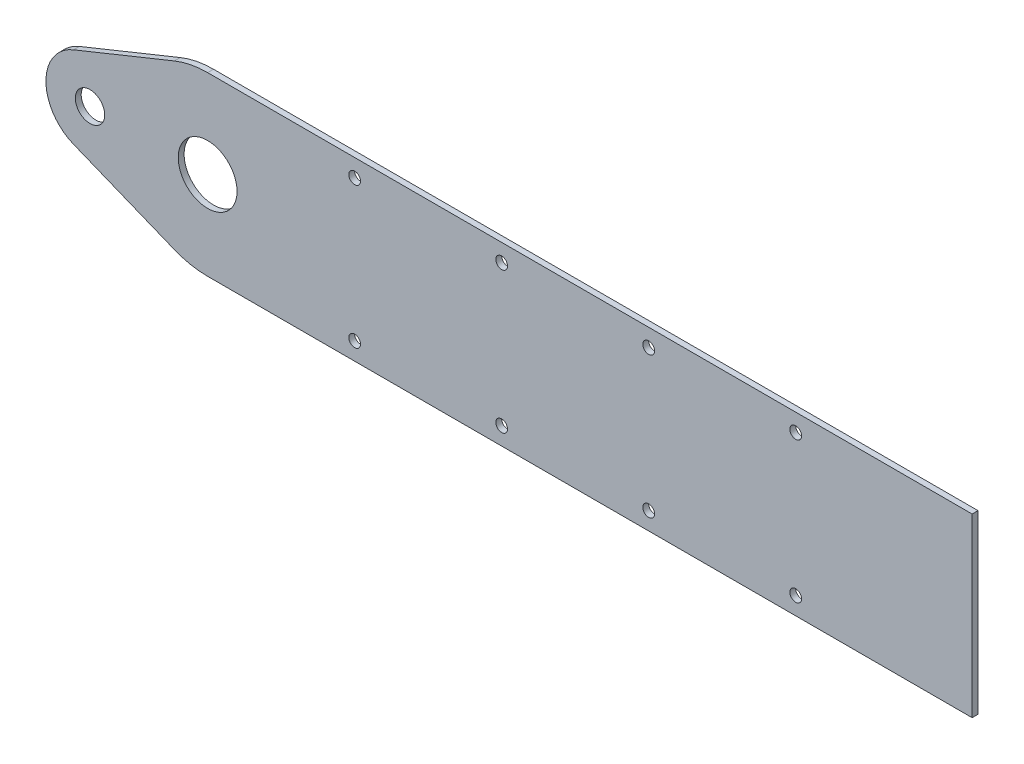
ISO-10303-21;
HEADER;
FILE_DESCRIPTION(('STEP AP214'),'2;1');
FILE_NAME('part.step','',(''),(''),'','','');
FILE_SCHEMA(('AUTOMOTIVE_DESIGN { 1 0 10303 214 1 1 1 1 }'));
ENDSEC;
DATA;
#1=APPLICATION_CONTEXT('core data for automotive mechanical design processes');
#2=APPLICATION_PROTOCOL_DEFINITION('international standard','automotive_design',2000,#1);
#3=PRODUCT_CONTEXT('',#1,'mechanical');
#4=PRODUCT('Part','Part','',(#3));
#5=PRODUCT_RELATED_PRODUCT_CATEGORY('part','',(#4));
#6=PRODUCT_DEFINITION_FORMATION('','',#4);
#7=PRODUCT_DEFINITION_CONTEXT('part definition',#1,'design');
#8=PRODUCT_DEFINITION('design','',#6,#7);
#9=PRODUCT_DEFINITION_SHAPE('','',#8);
#10=(LENGTH_UNIT() NAMED_UNIT(*) SI_UNIT(.MILLI.,.METRE.));
#11=(NAMED_UNIT(*) PLANE_ANGLE_UNIT() SI_UNIT($,.RADIAN.));
#12=(NAMED_UNIT(*) SI_UNIT($,.STERADIAN.) SOLID_ANGLE_UNIT());
#13=UNCERTAINTY_MEASURE_WITH_UNIT(LENGTH_MEASURE(1.E-05),#10,'distance_accuracy_value','');
#14=(GEOMETRIC_REPRESENTATION_CONTEXT(3) GLOBAL_UNCERTAINTY_ASSIGNED_CONTEXT((#13)) GLOBAL_UNIT_ASSIGNED_CONTEXT((#10,
#11,#12)) REPRESENTATION_CONTEXT('',''));
#15=CARTESIAN_POINT('',(0.,0.,0.));
#16=DIRECTION('',(0.,0.,1.));
#17=DIRECTION('',(1.,0.,0.));
#18=AXIS2_PLACEMENT_3D('',#15,#16,#17);
#19=CARTESIAN_POINT('',(-3.85305135054692E-05,4.94864565991904E-11,1.));
#20=DIRECTION('',(0.,0.,1.));
#21=DIRECTION('',(1.,0.,0.));
#22=AXIS2_PLACEMENT_3D('',#19,#20,#21);
#23=PLANE('',#22);
#24=CARTESIAN_POINT('',(75.,-12.,1.));
#25=DIRECTION('',(0.,0.,1.));
#26=DIRECTION('',(1.,0.,0.));
#27=AXIS2_PLACEMENT_3D('',#24,#25,#26);
#28=CIRCLE('',#27,0.999999999999998);
#29=CARTESIAN_POINT('',(76.,-12.,1.));
#30=VERTEX_POINT('',#29);
#31=EDGE_CURVE('E226',#30,#30,#28,.T.);
#32=ORIENTED_EDGE('',*,*,#31,.F.);
#33=EDGE_LOOP('',(#32));
#34=FACE_BOUND('',#33,.T.);
#35=CARTESIAN_POINT('',(100.,12.,1.));
#36=DIRECTION('',(0.,0.,1.));
#37=DIRECTION('',(1.,0.,0.));
#38=AXIS2_PLACEMENT_3D('',#35,#36,#37);
#39=CIRCLE('',#38,1.00000000000001);
#40=CARTESIAN_POINT('',(101.,12.,1.));
#41=VERTEX_POINT('',#40);
#42=EDGE_CURVE('E214',#41,#41,#39,.T.);
#43=ORIENTED_EDGE('',*,*,#42,.F.);
#44=EDGE_LOOP('',(#43));
#45=FACE_BOUND('',#44,.T.);
#46=CARTESIAN_POINT('',(75.,12.,1.));
#47=DIRECTION('',(0.,0.,1.));
#48=DIRECTION('',(1.,0.,0.));
#49=AXIS2_PLACEMENT_3D('',#46,#47,#48);
#50=CIRCLE('',#49,1.00000000000001);
#51=CARTESIAN_POINT('',(76.,12.,1.));
#52=VERTEX_POINT('',#51);
#53=EDGE_CURVE('E202',#52,#52,#50,.T.);
#54=ORIENTED_EDGE('',*,*,#53,.F.);
#55=EDGE_LOOP('',(#54));
#56=FACE_BOUND('',#55,.T.);
#57=CARTESIAN_POINT('',(-3.85305135054692E-05,4.94864565991904E-11,1.));
#58=DIRECTION('',(0.,0.,1.));
#59=DIRECTION('',(1.,0.,0.));
#60=AXIS2_PLACEMENT_3D('',#57,#58,#59);
#61=CIRCLE('',#60,5.00000000000001);
#62=CARTESIAN_POINT('',(4.99996146948651,4.94864565991904E-11,1.));
#63=VERTEX_POINT('',#62);
#64=EDGE_CURVE('E190',#63,#63,#61,.T.);
#65=ORIENTED_EDGE('',*,*,#64,.F.);
#66=EDGE_LOOP('',(#65));
#67=FACE_BOUND('',#66,.T.);
#68=CARTESIAN_POINT('',(25.,12.,1.));
#69=DIRECTION('',(0.,0.,1.));
#70=DIRECTION('',(1.,0.,0.));
#71=AXIS2_PLACEMENT_3D('',#68,#69,#70);
#72=CIRCLE('',#71,1.);
#73=CARTESIAN_POINT('',(26.,12.,1.));
#74=VERTEX_POINT('',#73);
#75=EDGE_CURVE('E136',#74,#74,#72,.T.);
#76=ORIENTED_EDGE('',*,*,#75,.F.);
#77=EDGE_LOOP('',(#76));
#78=FACE_BOUND('',#77,.T.);
#79=CARTESIAN_POINT('',(-3.85305135054692E-05,4.94864565991904E-11,1.));
#80=DIRECTION('',(0.,0.,1.));
#81=DIRECTION('',(1.,0.,0.));
#82=AXIS2_PLACEMENT_3D('',#79,#80,#81);
#83=CIRCLE('',#82,15.);
#84=CARTESIAN_POINT('',(0.,15.,1.));
#85=VERTEX_POINT('',#84);
#86=CARTESIAN_POINT('',(-5.64433370290361,13.8975512954013,1.));
#87=VERTEX_POINT('',#86);
#88=EDGE_CURVE('E147',#85,#87,#83,.T.);
#89=ORIENTED_EDGE('',*,*,#88,.T.);
#90=DIRECTION('',(-0.927024810886958,-0.375,0.));
#91=VECTOR('',#90,1.);
#92=CARTESIAN_POINT('',(-5.64433370290361,13.8975512954013,1.));
#93=LINE('',#92,#91);
#94=CARTESIAN_POINT('',(-22.8125,6.95268608165219,1.));
#95=VERTEX_POINT('',#94);
#96=EDGE_CURVE('E95',#87,#95,#93,.T.);
#97=ORIENTED_EDGE('',*,*,#96,.T.);
#98=CARTESIAN_POINT('',(-20.,0.,1.));
#99=DIRECTION('',(0.,0.,1.));
#100=DIRECTION('',(1.,0.,0.));
#101=AXIS2_PLACEMENT_3D('',#98,#99,#100);
#102=CIRCLE('',#101,7.5);
#103=CARTESIAN_POINT('',(-22.8125,-6.95268608165219,1.));
#104=VERTEX_POINT('',#103);
#105=EDGE_CURVE('E162',#95,#104,#102,.T.);
#106=ORIENTED_EDGE('',*,*,#105,.T.);
#107=DIRECTION('',(0.927024810886958,-0.375,0.));
#108=VECTOR('',#107,1.);
#109=CARTESIAN_POINT('',(-5.62499999999999,-13.9053721633044,1.));
#110=LINE('',#109,#108);
#111=CARTESIAN_POINT('',(-5.62499999999999,-13.9053721633044,1.));
#112=VERTEX_POINT('',#111);
#113=EDGE_CURVE('E175',#104,#112,#110,.T.);
#114=ORIENTED_EDGE('',*,*,#113,.T.);
#115=CARTESIAN_POINT('',(0.,0.,1.));
#116=DIRECTION('',(0.,0.,1.));
#117=DIRECTION('',(1.,0.,0.));
#118=AXIS2_PLACEMENT_3D('',#115,#116,#117);
#119=CIRCLE('',#118,15.);
#120=CARTESIAN_POINT('',(0.,-15.,1.));
#121=VERTEX_POINT('',#120);
#122=EDGE_CURVE('E114',#112,#121,#119,.T.);
#123=ORIENTED_EDGE('',*,*,#122,.T.);
#124=DIRECTION('',(1.,0.,0.));
#125=VECTOR('',#124,1.);
#126=CARTESIAN_POINT('',(0.,-15.,1.));
#127=LINE('',#126,#125);
#128=CARTESIAN_POINT('',(130.,-15.,1.));
#129=VERTEX_POINT('',#128);
#130=EDGE_CURVE('E108',#121,#129,#127,.T.);
#131=ORIENTED_EDGE('',*,*,#130,.T.);
#132=DIRECTION('',(0.,1.,0.));
#133=VECTOR('',#132,1.);
#134=CARTESIAN_POINT('',(130.,15.,1.));
#135=LINE('',#134,#133);
#136=CARTESIAN_POINT('',(130.,15.,1.));
#137=VERTEX_POINT('',#136);
#138=EDGE_CURVE('E112',#129,#137,#135,.T.);
#139=ORIENTED_EDGE('',*,*,#138,.T.);
#140=DIRECTION('',(-1.,0.,0.));
#141=VECTOR('',#140,1.);
#142=CARTESIAN_POINT('',(0.,15.,1.));
#143=LINE('',#142,#141);
#144=EDGE_CURVE('E52',#137,#85,#143,.T.);
#145=ORIENTED_EDGE('',*,*,#144,.T.);
#146=EDGE_LOOP('',(#89,#97,#106,#114,#123,#131,#139,#145));
#147=FACE_BOUND('',#146,.T.);
#148=CARTESIAN_POINT('',(-20.,0.,1.));
#149=DIRECTION('',(0.,0.,1.));
#150=DIRECTION('',(1.,0.,0.));
#151=AXIS2_PLACEMENT_3D('',#148,#149,#150);
#152=CIRCLE('',#151,2.5);
#153=CARTESIAN_POINT('',(-17.5,0.,1.));
#154=VERTEX_POINT('',#153);
#155=EDGE_CURVE('E184',#154,#154,#152,.T.);
#156=ORIENTED_EDGE('',*,*,#155,.F.);
#157=EDGE_LOOP('',(#156));
#158=FACE_BOUND('',#157,.T.);
#159=CARTESIAN_POINT('',(50.,12.,1.));
#160=DIRECTION('',(0.,0.,1.));
#161=DIRECTION('',(1.,0.,0.));
#162=AXIS2_PLACEMENT_3D('',#159,#160,#161);
#163=CIRCLE('',#162,1.00000000000001);
#164=CARTESIAN_POINT('',(51.,12.,1.));
#165=VERTEX_POINT('',#164);
#166=EDGE_CURVE('E196',#165,#165,#163,.T.);
#167=ORIENTED_EDGE('',*,*,#166,.F.);
#168=EDGE_LOOP('',(#167));
#169=FACE_BOUND('',#168,.T.);
#170=CARTESIAN_POINT('',(25.,-12.,1.));
#171=DIRECTION('',(0.,0.,1.));
#172=DIRECTION('',(1.,0.,0.));
#173=AXIS2_PLACEMENT_3D('',#170,#171,#172);
#174=CIRCLE('',#173,1.);
#175=CARTESIAN_POINT('',(26.,-12.,1.));
#176=VERTEX_POINT('',#175);
#177=EDGE_CURVE('E208',#176,#176,#174,.T.);
#178=ORIENTED_EDGE('',*,*,#177,.F.);
#179=EDGE_LOOP('',(#178));
#180=FACE_BOUND('',#179,.T.);
#181=CARTESIAN_POINT('',(50.,-12.,1.));
#182=DIRECTION('',(0.,0.,1.));
#183=DIRECTION('',(1.,0.,0.));
#184=AXIS2_PLACEMENT_3D('',#181,#182,#183);
#185=CIRCLE('',#184,1.00000000000001);
#186=CARTESIAN_POINT('',(51.,-12.,1.));
#187=VERTEX_POINT('',#186);
#188=EDGE_CURVE('E220',#187,#187,#185,.T.);
#189=ORIENTED_EDGE('',*,*,#188,.F.);
#190=EDGE_LOOP('',(#189));
#191=FACE_BOUND('',#190,.T.);
#192=CARTESIAN_POINT('',(100.,-12.,1.));
#193=DIRECTION('',(0.,0.,1.));
#194=DIRECTION('',(1.,0.,0.));
#195=AXIS2_PLACEMENT_3D('',#192,#193,#194);
#196=CIRCLE('',#195,0.999999999999998);
#197=CARTESIAN_POINT('',(101.,-12.,1.));
#198=VERTEX_POINT('',#197);
#199=EDGE_CURVE('E232',#198,#198,#196,.T.);
#200=ORIENTED_EDGE('',*,*,#199,.F.);
#201=EDGE_LOOP('',(#200));
#202=FACE_BOUND('',#201,.T.);
#203=ADVANCED_FACE('F35',(#34,#45,#56,#67,#78,#147,#158,#169,#180,#191,#202),#23,.T.);
#204=CARTESIAN_POINT('',(-3.85305135054692E-05,4.94864565991904E-11,0.));
#205=DIRECTION('',(0.,0.,1.));
#206=DIRECTION('',(1.,0.,0.));
#207=AXIS2_PLACEMENT_3D('',#204,#205,#206);
#208=PLANE('',#207);
#209=CARTESIAN_POINT('',(-3.85305135054692E-05,4.94864565991904E-11,0.));
#210=DIRECTION('',(0.,0.,1.));
#211=DIRECTION('',(1.,0.,0.));
#212=AXIS2_PLACEMENT_3D('',#209,#210,#211);
#213=CIRCLE('',#212,15.);
#214=CARTESIAN_POINT('',(0.,15.,0.));
#215=VERTEX_POINT('',#214);
#216=CARTESIAN_POINT('',(-5.64433370290361,13.8975512954013,0.));
#217=VERTEX_POINT('',#216);
#218=EDGE_CURVE('E132',#215,#217,#213,.T.);
#219=ORIENTED_EDGE('',*,*,#218,.F.);
#220=DIRECTION('',(-1.,0.,0.));
#221=VECTOR('',#220,1.);
#222=CARTESIAN_POINT('',(0.,15.,0.));
#223=LINE('',#222,#221);
#224=CARTESIAN_POINT('',(130.,15.,0.));
#225=VERTEX_POINT('',#224);
#226=EDGE_CURVE('E87',#225,#215,#223,.T.);
#227=ORIENTED_EDGE('',*,*,#226,.F.);
#228=DIRECTION('',(0.,1.,0.));
#229=VECTOR('',#228,1.);
#230=CARTESIAN_POINT('',(130.,15.,0.));
#231=LINE('',#230,#229);
#232=CARTESIAN_POINT('',(130.,-15.,0.));
#233=VERTEX_POINT('',#232);
#234=EDGE_CURVE('E81',#233,#225,#231,.T.);
#235=ORIENTED_EDGE('',*,*,#234,.F.);
#236=DIRECTION('',(1.,0.,0.));
#237=VECTOR('',#236,1.);
#238=CARTESIAN_POINT('',(0.,-15.,0.));
#239=LINE('',#238,#237);
#240=CARTESIAN_POINT('',(0.,-15.,0.));
#241=VERTEX_POINT('',#240);
#242=EDGE_CURVE('E122',#241,#233,#239,.T.);
#243=ORIENTED_EDGE('',*,*,#242,.F.);
#244=CARTESIAN_POINT('',(0.,0.,0.));
#245=DIRECTION('',(0.,0.,1.));
#246=DIRECTION('',(1.,0.,0.));
#247=AXIS2_PLACEMENT_3D('',#244,#245,#246);
#248=CIRCLE('',#247,15.);
#249=CARTESIAN_POINT('',(-5.62499999999999,-13.9053721633044,0.));
#250=VERTEX_POINT('',#249);
#251=EDGE_CURVE('E142',#250,#241,#248,.T.);
#252=ORIENTED_EDGE('',*,*,#251,.F.);
#253=DIRECTION('',(0.927024810886958,-0.375,0.));
#254=VECTOR('',#253,1.);
#255=CARTESIAN_POINT('',(-5.62499999999999,-13.9053721633044,0.));
#256=LINE('',#255,#254);
#257=CARTESIAN_POINT('',(-22.8125,-6.95268608165219,0.));
#258=VERTEX_POINT('',#257);
#259=EDGE_CURVE('E140',#258,#250,#256,.T.);
#260=ORIENTED_EDGE('',*,*,#259,.F.);
#261=CARTESIAN_POINT('',(-20.,0.,0.));
#262=DIRECTION('',(0.,0.,1.));
#263=DIRECTION('',(1.,0.,0.));
#264=AXIS2_PLACEMENT_3D('',#261,#262,#263);
#265=CIRCLE('',#264,7.5);
#266=CARTESIAN_POINT('',(-22.8125,6.95268608165219,0.));
#267=VERTEX_POINT('',#266);
#268=EDGE_CURVE('E138',#267,#258,#265,.T.);
#269=ORIENTED_EDGE('',*,*,#268,.F.);
#270=DIRECTION('',(-0.927024810886958,-0.375,0.));
#271=VECTOR('',#270,1.);
#272=CARTESIAN_POINT('',(-5.64433370290361,13.8975512954013,0.));
#273=LINE('',#272,#271);
#274=EDGE_CURVE('E135',#217,#267,#273,.T.);
#275=ORIENTED_EDGE('',*,*,#274,.F.);
#276=EDGE_LOOP('',(#219,#227,#235,#243,#252,#260,#269,#275));
#277=FACE_BOUND('',#276,.T.);
#278=CARTESIAN_POINT('',(25.,12.,0.));
#279=DIRECTION('',(0.,0.,1.));
#280=DIRECTION('',(1.,0.,0.));
#281=AXIS2_PLACEMENT_3D('',#278,#279,#280);
#282=CIRCLE('',#281,1.);
#283=CARTESIAN_POINT('',(26.,12.,0.));
#284=VERTEX_POINT('',#283);
#285=EDGE_CURVE('E181',#284,#284,#282,.T.);
#286=ORIENTED_EDGE('',*,*,#285,.T.);
#287=EDGE_LOOP('',(#286));
#288=FACE_BOUND('',#287,.T.);
#289=CARTESIAN_POINT('',(-20.,0.,0.));
#290=DIRECTION('',(0.,0.,1.));
#291=DIRECTION('',(1.,0.,0.));
#292=AXIS2_PLACEMENT_3D('',#289,#290,#291);
#293=CIRCLE('',#292,2.5);
#294=CARTESIAN_POINT('',(-17.5,0.,0.));
#295=VERTEX_POINT('',#294);
#296=EDGE_CURVE('E187',#295,#295,#293,.T.);
#297=ORIENTED_EDGE('',*,*,#296,.T.);
#298=EDGE_LOOP('',(#297));
#299=FACE_BOUND('',#298,.T.);
#300=CARTESIAN_POINT('',(-3.85305135054692E-05,4.94864565991904E-11,0.));
#301=DIRECTION('',(0.,0.,1.));
#302=DIRECTION('',(1.,0.,0.));
#303=AXIS2_PLACEMENT_3D('',#300,#301,#302);
#304=CIRCLE('',#303,5.00000000000001);
#305=CARTESIAN_POINT('',(4.99996146948651,4.94864565991904E-11,0.));
#306=VERTEX_POINT('',#305);
#307=EDGE_CURVE('E193',#306,#306,#304,.T.);
#308=ORIENTED_EDGE('',*,*,#307,.T.);
#309=EDGE_LOOP('',(#308));
#310=FACE_BOUND('',#309,.T.);
#311=CARTESIAN_POINT('',(50.,12.,0.));
#312=DIRECTION('',(0.,0.,1.));
#313=DIRECTION('',(1.,0.,0.));
#314=AXIS2_PLACEMENT_3D('',#311,#312,#313);
#315=CIRCLE('',#314,1.00000000000001);
#316=CARTESIAN_POINT('',(51.,12.,0.));
#317=VERTEX_POINT('',#316);
#318=EDGE_CURVE('E199',#317,#317,#315,.T.);
#319=ORIENTED_EDGE('',*,*,#318,.T.);
#320=EDGE_LOOP('',(#319));
#321=FACE_BOUND('',#320,.T.);
#322=CARTESIAN_POINT('',(75.,12.,0.));
#323=DIRECTION('',(0.,0.,1.));
#324=DIRECTION('',(1.,0.,0.));
#325=AXIS2_PLACEMENT_3D('',#322,#323,#324);
#326=CIRCLE('',#325,1.00000000000001);
#327=CARTESIAN_POINT('',(76.,12.,0.));
#328=VERTEX_POINT('',#327);
#329=EDGE_CURVE('E205',#328,#328,#326,.T.);
#330=ORIENTED_EDGE('',*,*,#329,.T.);
#331=EDGE_LOOP('',(#330));
#332=FACE_BOUND('',#331,.T.);
#333=CARTESIAN_POINT('',(25.,-12.,0.));
#334=DIRECTION('',(0.,0.,1.));
#335=DIRECTION('',(1.,0.,0.));
#336=AXIS2_PLACEMENT_3D('',#333,#334,#335);
#337=CIRCLE('',#336,1.);
#338=CARTESIAN_POINT('',(26.,-12.,0.));
#339=VERTEX_POINT('',#338);
#340=EDGE_CURVE('E211',#339,#339,#337,.T.);
#341=ORIENTED_EDGE('',*,*,#340,.T.);
#342=EDGE_LOOP('',(#341));
#343=FACE_BOUND('',#342,.T.);
#344=CARTESIAN_POINT('',(100.,12.,0.));
#345=DIRECTION('',(0.,0.,1.));
#346=DIRECTION('',(1.,0.,0.));
#347=AXIS2_PLACEMENT_3D('',#344,#345,#346);
#348=CIRCLE('',#347,1.00000000000001);
#349=CARTESIAN_POINT('',(101.,12.,0.));
#350=VERTEX_POINT('',#349);
#351=EDGE_CURVE('E217',#350,#350,#348,.T.);
#352=ORIENTED_EDGE('',*,*,#351,.T.);
#353=EDGE_LOOP('',(#352));
#354=FACE_BOUND('',#353,.T.);
#355=CARTESIAN_POINT('',(50.,-12.,0.));
#356=DIRECTION('',(0.,0.,1.));
#357=DIRECTION('',(1.,0.,0.));
#358=AXIS2_PLACEMENT_3D('',#355,#356,#357);
#359=CIRCLE('',#358,1.00000000000001);
#360=CARTESIAN_POINT('',(51.,-12.,0.));
#361=VERTEX_POINT('',#360);
#362=EDGE_CURVE('E223',#361,#361,#359,.T.);
#363=ORIENTED_EDGE('',*,*,#362,.T.);
#364=EDGE_LOOP('',(#363));
#365=FACE_BOUND('',#364,.T.);
#366=CARTESIAN_POINT('',(75.,-12.,0.));
#367=DIRECTION('',(0.,0.,1.));
#368=DIRECTION('',(1.,0.,0.));
#369=AXIS2_PLACEMENT_3D('',#366,#367,#368);
#370=CIRCLE('',#369,0.999999999999998);
#371=CARTESIAN_POINT('',(76.,-12.,0.));
#372=VERTEX_POINT('',#371);
#373=EDGE_CURVE('E229',#372,#372,#370,.T.);
#374=ORIENTED_EDGE('',*,*,#373,.T.);
#375=EDGE_LOOP('',(#374));
#376=FACE_BOUND('',#375,.T.);
#377=CARTESIAN_POINT('',(100.,-12.,0.));
#378=DIRECTION('',(0.,0.,1.));
#379=DIRECTION('',(1.,0.,0.));
#380=AXIS2_PLACEMENT_3D('',#377,#378,#379);
#381=CIRCLE('',#380,0.999999999999998);
#382=CARTESIAN_POINT('',(101.,-12.,0.));
#383=VERTEX_POINT('',#382);
#384=EDGE_CURVE('E235',#383,#383,#381,.T.);
#385=ORIENTED_EDGE('',*,*,#384,.T.);
#386=EDGE_LOOP('',(#385));
#387=FACE_BOUND('',#386,.T.);
#388=ADVANCED_FACE('F166',(#277,#288,#299,#310,#321,#332,#343,#354,#365,#376,#387),#208,.F.);
#389=CARTESIAN_POINT('',(-3.85305135054692E-05,4.94864565991904E-11,1.));
#390=DIRECTION('',(0.,0.,-1.));
#391=DIRECTION('',(-1.,0.,0.));
#392=AXIS2_PLACEMENT_3D('',#389,#390,#391);
#393=CYLINDRICAL_SURFACE('',#392,15.);
#394=ORIENTED_EDGE('',*,*,#218,.T.);
#395=DIRECTION('',(0.,0.,-1.));
#396=VECTOR('',#395,1.);
#397=CARTESIAN_POINT('',(-5.64433370290361,13.8975512954013,1.));
#398=LINE('',#397,#396);
#399=EDGE_CURVE('E11',#87,#217,#398,.T.);
#400=ORIENTED_EDGE('',*,*,#399,.F.);
#401=ORIENTED_EDGE('',*,*,#88,.F.);
#402=DIRECTION('',(0.,0.,-1.));
#403=VECTOR('',#402,1.);
#404=CARTESIAN_POINT('',(0.,15.,1.));
#405=LINE('',#404,#403);
#406=EDGE_CURVE('E128',#85,#215,#405,.T.);
#407=ORIENTED_EDGE('',*,*,#406,.T.);
#408=EDGE_LOOP('',(#394,#400,#401,#407));
#409=FACE_BOUND('',#408,.T.);
#410=ADVANCED_FACE('F37',(#409),#393,.T.);
#411=CARTESIAN_POINT('',(-5.64433370290361,13.8975512954013,1.));
#412=DIRECTION('',(0.375,-0.927024810886958,0.));
#413=DIRECTION('',(0.927024810886958,0.375,0.));
#414=AXIS2_PLACEMENT_3D('',#411,#412,#413);
#415=PLANE('',#414);
#416=ORIENTED_EDGE('',*,*,#274,.T.);
#417=DIRECTION('',(0.,0.,-1.));
#418=VECTOR('',#417,1.);
#419=CARTESIAN_POINT('',(-22.8125,6.95268608165219,1.));
#420=LINE('',#419,#418);
#421=EDGE_CURVE('E44',#95,#267,#420,.T.);
#422=ORIENTED_EDGE('',*,*,#421,.F.);
#423=ORIENTED_EDGE('',*,*,#96,.F.);
#424=ORIENTED_EDGE('',*,*,#399,.T.);
#425=EDGE_LOOP('',(#416,#422,#423,#424));
#426=FACE_BOUND('',#425,.T.);
#427=ADVANCED_FACE('F269',(#426),#415,.F.);
#428=CARTESIAN_POINT('',(-20.,0.,1.));
#429=DIRECTION('',(0.,0.,-1.));
#430=DIRECTION('',(-1.,0.,0.));
#431=AXIS2_PLACEMENT_3D('',#428,#429,#430);
#432=CYLINDRICAL_SURFACE('',#431,7.5);
#433=ORIENTED_EDGE('',*,*,#268,.T.);
#434=DIRECTION('',(0.,0.,-1.));
#435=VECTOR('',#434,1.);
#436=CARTESIAN_POINT('',(-22.8125,-6.95268608165219,1.));
#437=LINE('',#436,#435);
#438=EDGE_CURVE('E154',#104,#258,#437,.T.);
#439=ORIENTED_EDGE('',*,*,#438,.F.);
#440=ORIENTED_EDGE('',*,*,#105,.F.);
#441=ORIENTED_EDGE('',*,*,#421,.T.);
#442=EDGE_LOOP('',(#433,#439,#440,#441));
#443=FACE_BOUND('',#442,.T.);
#444=ADVANCED_FACE('F160',(#443),#432,.T.);
#445=CARTESIAN_POINT('',(-5.62499999999999,-13.9053721633044,1.));
#446=DIRECTION('',(0.375,0.927024810886958,0.));
#447=DIRECTION('',(-0.927024810886958,0.375,0.));
#448=AXIS2_PLACEMENT_3D('',#445,#446,#447);
#449=PLANE('',#448);
#450=ORIENTED_EDGE('',*,*,#259,.T.);
#451=DIRECTION('',(0.,0.,-1.));
#452=VECTOR('',#451,1.);
#453=CARTESIAN_POINT('',(-5.62499999999999,-13.9053721633044,1.));
#454=LINE('',#453,#452);
#455=EDGE_CURVE('E151',#112,#250,#454,.T.);
#456=ORIENTED_EDGE('',*,*,#455,.F.);
#457=ORIENTED_EDGE('',*,*,#113,.F.);
#458=ORIENTED_EDGE('',*,*,#438,.T.);
#459=EDGE_LOOP('',(#450,#456,#457,#458));
#460=FACE_BOUND('',#459,.T.);
#461=ADVANCED_FACE('F171',(#460),#449,.F.);
#462=CARTESIAN_POINT('',(0.,0.,1.));
#463=DIRECTION('',(0.,0.,-1.));
#464=DIRECTION('',(-1.,0.,0.));
#465=AXIS2_PLACEMENT_3D('',#462,#463,#464);
#466=CYLINDRICAL_SURFACE('',#465,15.);
#467=ORIENTED_EDGE('',*,*,#251,.T.);
#468=DIRECTION('',(0.,0.,-1.));
#469=VECTOR('',#468,1.);
#470=CARTESIAN_POINT('',(0.,-15.,1.));
#471=LINE('',#470,#469);
#472=EDGE_CURVE('E123',#121,#241,#471,.T.);
#473=ORIENTED_EDGE('',*,*,#472,.F.);
#474=ORIENTED_EDGE('',*,*,#122,.F.);
#475=ORIENTED_EDGE('',*,*,#455,.T.);
#476=EDGE_LOOP('',(#467,#473,#474,#475));
#477=FACE_BOUND('',#476,.T.);
#478=ADVANCED_FACE('F174',(#477),#466,.T.);
#479=CARTESIAN_POINT('',(0.,-15.,1.));
#480=DIRECTION('',(0.,1.,0.));
#481=DIRECTION('',(0.,0.,1.));
#482=AXIS2_PLACEMENT_3D('',#479,#480,#481);
#483=PLANE('',#482);
#484=ORIENTED_EDGE('',*,*,#242,.T.);
#485=DIRECTION('',(0.,0.,-1.));
#486=VECTOR('',#485,1.);
#487=CARTESIAN_POINT('',(130.,-15.,1.));
#488=LINE('',#487,#486);
#489=EDGE_CURVE('E119',#129,#233,#488,.T.);
#490=ORIENTED_EDGE('',*,*,#489,.F.);
#491=ORIENTED_EDGE('',*,*,#130,.F.);
#492=ORIENTED_EDGE('',*,*,#472,.T.);
#493=EDGE_LOOP('',(#484,#490,#491,#492));
#494=FACE_BOUND('',#493,.T.);
#495=ADVANCED_FACE('F120',(#494),#483,.F.);
#496=CARTESIAN_POINT('',(130.,15.,1.));
#497=DIRECTION('',(-1.,0.,0.));
#498=DIRECTION('',(0.,0.,1.));
#499=AXIS2_PLACEMENT_3D('',#496,#497,#498);
#500=PLANE('',#499);
#501=ORIENTED_EDGE('',*,*,#234,.T.);
#502=DIRECTION('',(0.,0.,-1.));
#503=VECTOR('',#502,1.);
#504=CARTESIAN_POINT('',(130.,15.,1.));
#505=LINE('',#504,#503);
#506=EDGE_CURVE('E124',#137,#225,#505,.T.);
#507=ORIENTED_EDGE('',*,*,#506,.F.);
#508=ORIENTED_EDGE('',*,*,#138,.F.);
#509=ORIENTED_EDGE('',*,*,#489,.T.);
#510=EDGE_LOOP('',(#501,#507,#508,#509));
#511=FACE_BOUND('',#510,.T.);
#512=ADVANCED_FACE('F126',(#511),#500,.F.);
#513=CARTESIAN_POINT('',(0.,15.,1.));
#514=DIRECTION('',(0.,-1.,0.));
#515=DIRECTION('',(1.,0.,0.));
#516=AXIS2_PLACEMENT_3D('',#513,#514,#515);
#517=PLANE('',#516);
#518=ORIENTED_EDGE('',*,*,#226,.T.);
#519=ORIENTED_EDGE('',*,*,#406,.F.);
#520=ORIENTED_EDGE('',*,*,#144,.F.);
#521=ORIENTED_EDGE('',*,*,#506,.T.);
#522=EDGE_LOOP('',(#518,#519,#520,#521));
#523=FACE_BOUND('',#522,.T.);
#524=ADVANCED_FACE('F257',(#523),#517,.F.);
#525=CARTESIAN_POINT('',(25.,12.,1.));
#526=DIRECTION('',(0.,0.,-1.));
#527=DIRECTION('',(-1.,0.,0.));
#528=AXIS2_PLACEMENT_3D('',#525,#526,#527);
#529=CYLINDRICAL_SURFACE('',#528,1.);
#530=ORIENTED_EDGE('',*,*,#75,.T.);
#531=EDGE_LOOP('',(#530));
#532=FACE_BOUND('',#531,.T.);
#533=ORIENTED_EDGE('',*,*,#285,.F.);
#534=EDGE_LOOP('',(#533));
#535=FACE_BOUND('',#534,.T.);
#536=ADVANCED_FACE('F254',(#532,#535),#529,.F.);
#537=CARTESIAN_POINT('',(-20.,0.,1.));
#538=DIRECTION('',(0.,0.,-1.));
#539=DIRECTION('',(-1.,0.,0.));
#540=AXIS2_PLACEMENT_3D('',#537,#538,#539);
#541=CYLINDRICAL_SURFACE('',#540,2.5);
#542=ORIENTED_EDGE('',*,*,#155,.T.);
#543=EDGE_LOOP('',(#542));
#544=FACE_BOUND('',#543,.T.);
#545=ORIENTED_EDGE('',*,*,#296,.F.);
#546=EDGE_LOOP('',(#545));
#547=FACE_BOUND('',#546,.T.);
#548=ADVANCED_FACE('F333',(#544,#547),#541,.F.);
#549=CARTESIAN_POINT('',(-3.85305135054692E-05,4.94864565991904E-11,1.));
#550=DIRECTION('',(0.,0.,-1.));
#551=DIRECTION('',(-1.,0.,0.));
#552=AXIS2_PLACEMENT_3D('',#549,#550,#551);
#553=CYLINDRICAL_SURFACE('',#552,5.00000000000001);
#554=ORIENTED_EDGE('',*,*,#64,.T.);
#555=EDGE_LOOP('',(#554));
#556=FACE_BOUND('',#555,.T.);
#557=ORIENTED_EDGE('',*,*,#307,.F.);
#558=EDGE_LOOP('',(#557));
#559=FACE_BOUND('',#558,.T.);
#560=ADVANCED_FACE('F341',(#556,#559),#553,.F.);
#561=CARTESIAN_POINT('',(50.,12.,1.));
#562=DIRECTION('',(0.,0.,-1.));
#563=DIRECTION('',(-1.,0.,0.));
#564=AXIS2_PLACEMENT_3D('',#561,#562,#563);
#565=CYLINDRICAL_SURFACE('',#564,1.00000000000001);
#566=ORIENTED_EDGE('',*,*,#166,.T.);
#567=EDGE_LOOP('',(#566));
#568=FACE_BOUND('',#567,.T.);
#569=ORIENTED_EDGE('',*,*,#318,.F.);
#570=EDGE_LOOP('',(#569));
#571=FACE_BOUND('',#570,.T.);
#572=ADVANCED_FACE('F349',(#568,#571),#565,.F.);
#573=CARTESIAN_POINT('',(75.,12.,1.));
#574=DIRECTION('',(0.,0.,-1.));
#575=DIRECTION('',(-1.,0.,0.));
#576=AXIS2_PLACEMENT_3D('',#573,#574,#575);
#577=CYLINDRICAL_SURFACE('',#576,1.00000000000001);
#578=ORIENTED_EDGE('',*,*,#53,.T.);
#579=EDGE_LOOP('',(#578));
#580=FACE_BOUND('',#579,.T.);
#581=ORIENTED_EDGE('',*,*,#329,.F.);
#582=EDGE_LOOP('',(#581));
#583=FACE_BOUND('',#582,.T.);
#584=ADVANCED_FACE('F358',(#580,#583),#577,.F.);
#585=CARTESIAN_POINT('',(25.,-12.,1.));
#586=DIRECTION('',(0.,0.,-1.));
#587=DIRECTION('',(-1.,0.,0.));
#588=AXIS2_PLACEMENT_3D('',#585,#586,#587);
#589=CYLINDRICAL_SURFACE('',#588,1.);
#590=ORIENTED_EDGE('',*,*,#177,.T.);
#591=EDGE_LOOP('',(#590));
#592=FACE_BOUND('',#591,.T.);
#593=ORIENTED_EDGE('',*,*,#340,.F.);
#594=EDGE_LOOP('',(#593));
#595=FACE_BOUND('',#594,.T.);
#596=ADVANCED_FACE('F367',(#592,#595),#589,.F.);
#597=CARTESIAN_POINT('',(100.,12.,1.));
#598=DIRECTION('',(0.,0.,-1.));
#599=DIRECTION('',(-1.,0.,0.));
#600=AXIS2_PLACEMENT_3D('',#597,#598,#599);
#601=CYLINDRICAL_SURFACE('',#600,1.00000000000001);
#602=ORIENTED_EDGE('',*,*,#42,.T.);
#603=EDGE_LOOP('',(#602));
#604=FACE_BOUND('',#603,.T.);
#605=ORIENTED_EDGE('',*,*,#351,.F.);
#606=EDGE_LOOP('',(#605));
#607=FACE_BOUND('',#606,.T.);
#608=ADVANCED_FACE('F376',(#604,#607),#601,.F.);
#609=CARTESIAN_POINT('',(50.,-12.,1.));
#610=DIRECTION('',(0.,0.,-1.));
#611=DIRECTION('',(-1.,0.,0.));
#612=AXIS2_PLACEMENT_3D('',#609,#610,#611);
#613=CYLINDRICAL_SURFACE('',#612,1.00000000000001);
#614=ORIENTED_EDGE('',*,*,#188,.T.);
#615=EDGE_LOOP('',(#614));
#616=FACE_BOUND('',#615,.T.);
#617=ORIENTED_EDGE('',*,*,#362,.F.);
#618=EDGE_LOOP('',(#617));
#619=FACE_BOUND('',#618,.T.);
#620=ADVANCED_FACE('F385',(#616,#619),#613,.F.);
#621=CARTESIAN_POINT('',(75.,-12.,1.));
#622=DIRECTION('',(0.,0.,-1.));
#623=DIRECTION('',(-1.,0.,0.));
#624=AXIS2_PLACEMENT_3D('',#621,#622,#623);
#625=CYLINDRICAL_SURFACE('',#624,0.999999999999998);
#626=ORIENTED_EDGE('',*,*,#31,.T.);
#627=EDGE_LOOP('',(#626));
#628=FACE_BOUND('',#627,.T.);
#629=ORIENTED_EDGE('',*,*,#373,.F.);
#630=EDGE_LOOP('',(#629));
#631=FACE_BOUND('',#630,.T.);
#632=ADVANCED_FACE('F394',(#628,#631),#625,.F.);
#633=CARTESIAN_POINT('',(100.,-12.,1.));
#634=DIRECTION('',(0.,0.,-1.));
#635=DIRECTION('',(-1.,0.,0.));
#636=AXIS2_PLACEMENT_3D('',#633,#634,#635);
#637=CYLINDRICAL_SURFACE('',#636,0.999999999999998);
#638=ORIENTED_EDGE('',*,*,#199,.T.);
#639=EDGE_LOOP('',(#638));
#640=FACE_BOUND('',#639,.T.);
#641=ORIENTED_EDGE('',*,*,#384,.F.);
#642=EDGE_LOOP('',(#641));
#643=FACE_BOUND('',#642,.T.);
#644=ADVANCED_FACE('F241',(#640,#643),#637,.F.);
#645=CLOSED_SHELL('',(#203,#388,#410,#427,#444,#461,#478,#495,#512,#524,#536,#548,#560,#572,
#584,#596,#608,#620,#632,#644));
#646=MANIFOLD_SOLID_BREP('B2',#645);
#647=ADVANCED_BREP_SHAPE_REPRESENTATION('',(#18,#646),#14);
#648=SHAPE_DEFINITION_REPRESENTATION(#9,#647);
ENDSEC;
END-ISO-10303-21;
